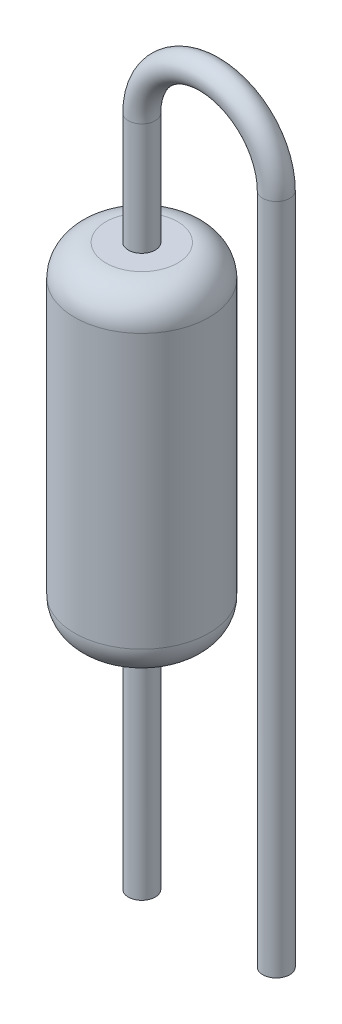
ISO-10303-21;
HEADER;
FILE_DESCRIPTION(('STEP AP214'),'2;1');
FILE_NAME('part.step','',(''),(''),'','','');
FILE_SCHEMA(('AUTOMOTIVE_DESIGN { 1 0 10303 214 1 1 1 1 }'));
ENDSEC;
DATA;
#1=APPLICATION_CONTEXT('core data for automotive mechanical design processes');
#2=APPLICATION_PROTOCOL_DEFINITION('international standard','automotive_design',2000,#1);
#3=PRODUCT_CONTEXT('',#1,'mechanical');
#4=PRODUCT('Part','Part','',(#3));
#5=PRODUCT_RELATED_PRODUCT_CATEGORY('part','',(#4));
#6=PRODUCT_DEFINITION_FORMATION('','',#4);
#7=PRODUCT_DEFINITION_CONTEXT('part definition',#1,'design');
#8=PRODUCT_DEFINITION('design','',#6,#7);
#9=PRODUCT_DEFINITION_SHAPE('','',#8);
#10=(LENGTH_UNIT() NAMED_UNIT(*) SI_UNIT(.MILLI.,.METRE.));
#11=(NAMED_UNIT(*) PLANE_ANGLE_UNIT() SI_UNIT($,.RADIAN.));
#12=(NAMED_UNIT(*) SI_UNIT($,.STERADIAN.) SOLID_ANGLE_UNIT());
#13=UNCERTAINTY_MEASURE_WITH_UNIT(LENGTH_MEASURE(1.E-05),#10,'distance_accuracy_value','');
#14=(GEOMETRIC_REPRESENTATION_CONTEXT(3) GLOBAL_UNCERTAINTY_ASSIGNED_CONTEXT((#13)) GLOBAL_UNIT_ASSIGNED_CONTEXT((#10,
#11,#12)) REPRESENTATION_CONTEXT('',''));
#15=CARTESIAN_POINT('',(0.,0.,0.));
#16=DIRECTION('',(0.,0.,1.));
#17=DIRECTION('',(1.,0.,0.));
#18=AXIS2_PLACEMENT_3D('',#15,#16,#17);
#19=CARTESIAN_POINT('',(0.,15.,0.));
#20=DIRECTION('',(0.,-1.,0.));
#21=DIRECTION('',(0.,0.,-1.));
#22=AXIS2_PLACEMENT_3D('',#19,#20,#21);
#23=CYLINDRICAL_SURFACE('',#22,0.3);
#24=CARTESIAN_POINT('',(0.,15.,0.));
#25=DIRECTION('',(0.,1.,0.));
#26=DIRECTION('',(0.,0.,1.));
#27=AXIS2_PLACEMENT_3D('',#24,#25,#26);
#28=CIRCLE('',#27,0.3);
#29=CARTESIAN_POINT('',(-0.3,15.,0.));
#30=VERTEX_POINT('',#29);
#31=EDGE_CURVE('E62',#30,#30,#28,.T.);
#32=ORIENTED_EDGE('',*,*,#31,.F.);
#33=EDGE_LOOP('',(#32));
#34=FACE_BOUND('',#33,.T.);
#35=CARTESIAN_POINT('',(0.,12.5,0.));
#36=DIRECTION('',(0.,-1.,0.));
#37=DIRECTION('',(0.,0.,-1.));
#38=AXIS2_PLACEMENT_3D('',#35,#36,#37);
#39=CIRCLE('',#38,0.3);
#40=CARTESIAN_POINT('',(0.,12.5,-0.3));
#41=VERTEX_POINT('',#40);
#42=EDGE_CURVE('E49',#41,#41,#39,.T.);
#43=ORIENTED_EDGE('',*,*,#42,.F.);
#44=EDGE_LOOP('',(#43));
#45=FACE_BOUND('',#44,.T.);
#46=ADVANCED_FACE('F29',(#34,#45),#23,.T.);
#47=CARTESIAN_POINT('',(3.,15.,0.));
#48=DIRECTION('',(0.,-1.,0.));
#49=DIRECTION('',(1.,0.,0.));
#50=AXIS2_PLACEMENT_3D('',#47,#48,#49);
#51=CYLINDRICAL_SURFACE('',#50,0.3);
#52=CARTESIAN_POINT('',(3.,15.,0.));
#53=DIRECTION('',(0.,-1.,0.));
#54=DIRECTION('',(0.,0.,1.));
#55=AXIS2_PLACEMENT_3D('',#52,#53,#54);
#56=CIRCLE('',#55,0.3);
#57=CARTESIAN_POINT('',(3.3,15.,0.));
#58=VERTEX_POINT('',#57);
#59=EDGE_CURVE('E59',#58,#58,#56,.T.);
#60=ORIENTED_EDGE('',*,*,#59,.T.);
#61=EDGE_LOOP('',(#60));
#62=FACE_BOUND('',#61,.T.);
#63=CARTESIAN_POINT('',(3.,0.,0.));
#64=DIRECTION('',(0.,-1.,0.));
#65=DIRECTION('',(0.,0.,1.));
#66=AXIS2_PLACEMENT_3D('',#63,#64,#65);
#67=CIRCLE('',#66,0.3);
#68=CARTESIAN_POINT('',(3.,0.,0.3));
#69=VERTEX_POINT('',#68);
#70=EDGE_CURVE('E52',#69,#69,#67,.T.);
#71=ORIENTED_EDGE('',*,*,#70,.F.);
#72=EDGE_LOOP('',(#71));
#73=FACE_BOUND('',#72,.T.);
#74=ADVANCED_FACE('F73',(#62,#73),#51,.T.);
#75=CARTESIAN_POINT('',(1.5,15.,0.));
#76=DIRECTION('',(0.,0.,-1.));
#77=DIRECTION('',(-1.,0.,0.));
#78=AXIS2_PLACEMENT_3D('',#75,#76,#77);
#79=TOROIDAL_SURFACE('',#78,1.5,0.3);
#80=CARTESIAN_POINT('',(1.5,15.,0.));
#81=DIRECTION('',(0.,0.,-1.));
#82=DIRECTION('',(-1.,0.,0.));
#83=AXIS2_PLACEMENT_3D('',#80,#81,#82);
#84=CIRCLE('',#83,1.8);
#85=EDGE_CURVE('',#30,#58,#84,.T.);
#86=ORIENTED_EDGE('',*,*,#31,.T.);
#87=ORIENTED_EDGE('',*,*,#59,.F.);
#88=ORIENTED_EDGE('',*,*,#85,.T.);
#89=ORIENTED_EDGE('',*,*,#85,.F.);
#90=EDGE_LOOP('',(#86,#88,#87,#89));
#91=FACE_BOUND('',#90,.T.);
#92=ADVANCED_FACE('F68',(#91),#79,.T.);
#93=CARTESIAN_POINT('',(3.,0.,0.));
#94=DIRECTION('',(0.,-1.,0.));
#95=DIRECTION('',(0.,0.,1.));
#96=AXIS2_PLACEMENT_3D('',#93,#94,#95);
#97=PLANE('',#96);
#98=ORIENTED_EDGE('',*,*,#70,.T.);
#99=EDGE_LOOP('',(#98));
#100=FACE_BOUND('',#99,.T.);
#101=ADVANCED_FACE('F81',(#100),#97,.T.);
#102=CARTESIAN_POINT('',(0.,12.5,0.));
#103=DIRECTION('',(0.,-1.,0.));
#104=DIRECTION('',(0.,0.,-1.));
#105=AXIS2_PLACEMENT_3D('',#102,#103,#104);
#106=PLANE('',#105);
#107=CARTESIAN_POINT('',(0.,12.5,0.));
#108=DIRECTION('',(0.,-1.,0.));
#109=DIRECTION('',(0.,0.,-1.));
#110=AXIS2_PLACEMENT_3D('',#107,#108,#109);
#111=CIRCLE('',#110,0.8);
#112=CARTESIAN_POINT('',(0.,12.5,-0.8));
#113=VERTEX_POINT('',#112);
#114=EDGE_CURVE('E36',#113,#113,#111,.F.);
#115=ORIENTED_EDGE('',*,*,#114,.T.);
#116=EDGE_LOOP('',(#115));
#117=FACE_BOUND('',#116,.T.);
#118=ORIENTED_EDGE('',*,*,#42,.T.);
#119=EDGE_LOOP('',(#118));
#120=FACE_BOUND('',#119,.T.);
#121=ADVANCED_FACE('F78',(#117,#120),#106,.F.);
#122=CARTESIAN_POINT('',(0.,5.,0.));
#123=DIRECTION('',(0.,-1.,0.));
#124=DIRECTION('',(0.,0.,-1.));
#125=AXIS2_PLACEMENT_3D('',#122,#123,#124);
#126=PLANE('',#125);
#127=CARTESIAN_POINT('',(0.,5.,0.));
#128=DIRECTION('',(0.,-1.,0.));
#129=DIRECTION('',(0.,0.,-1.));
#130=AXIS2_PLACEMENT_3D('',#127,#128,#129);
#131=CIRCLE('',#130,0.8);
#132=CARTESIAN_POINT('',(0.,5.,-0.8));
#133=VERTEX_POINT('',#132);
#134=EDGE_CURVE('E10',#133,#133,#131,.T.);
#135=ORIENTED_EDGE('',*,*,#134,.T.);
#136=EDGE_LOOP('',(#135));
#137=FACE_BOUND('',#136,.T.);
#138=CARTESIAN_POINT('',(0.,5.,0.));
#139=DIRECTION('',(0.,-1.,0.));
#140=DIRECTION('',(0.,0.,-1.));
#141=AXIS2_PLACEMENT_3D('',#138,#139,#140);
#142=CIRCLE('',#141,0.3);
#143=CARTESIAN_POINT('',(0.,5.,-0.3));
#144=VERTEX_POINT('',#143);
#145=EDGE_CURVE('E53',#144,#144,#142,.T.);
#146=ORIENTED_EDGE('',*,*,#145,.F.);
#147=EDGE_LOOP('',(#146));
#148=FACE_BOUND('',#147,.T.);
#149=ADVANCED_FACE('F80',(#137,#148),#126,.T.);
#150=CARTESIAN_POINT('',(0.,12.5,0.));
#151=DIRECTION('',(0.,-1.,0.));
#152=DIRECTION('',(0.,0.,-1.));
#153=AXIS2_PLACEMENT_3D('',#150,#151,#152);
#154=CYLINDRICAL_SURFACE('',#153,1.5);
#155=CARTESIAN_POINT('',(0.,11.8,0.));
#156=DIRECTION('',(0.,-1.,0.));
#157=DIRECTION('',(0.,0.,-1.));
#158=AXIS2_PLACEMENT_3D('',#155,#156,#157);
#159=CIRCLE('',#158,1.5);
#160=CARTESIAN_POINT('',(0.,11.8,-1.5));
#161=VERTEX_POINT('',#160);
#162=EDGE_CURVE('E40',#161,#161,#159,.T.);
#163=ORIENTED_EDGE('',*,*,#162,.T.);
#164=EDGE_LOOP('',(#163));
#165=FACE_BOUND('',#164,.T.);
#166=CARTESIAN_POINT('',(0.,5.7,0.));
#167=DIRECTION('',(0.,-1.,0.));
#168=DIRECTION('',(0.,0.,-1.));
#169=AXIS2_PLACEMENT_3D('',#166,#167,#168);
#170=CIRCLE('',#169,1.5);
#171=CARTESIAN_POINT('',(0.,5.7,-1.5));
#172=VERTEX_POINT('',#171);
#173=EDGE_CURVE('E44',#172,#172,#170,.F.);
#174=ORIENTED_EDGE('',*,*,#173,.T.);
#175=EDGE_LOOP('',(#174));
#176=FACE_BOUND('',#175,.T.);
#177=ADVANCED_FACE('F87',(#165,#176),#154,.T.);
#178=CARTESIAN_POINT('',(0.,0.,0.));
#179=DIRECTION('',(0.,1.,0.));
#180=DIRECTION('',(0.,0.,1.));
#181=AXIS2_PLACEMENT_3D('',#178,#179,#180);
#182=PLANE('',#181);
#183=CARTESIAN_POINT('',(0.,0.,0.));
#184=DIRECTION('',(0.,1.,0.));
#185=DIRECTION('',(0.,0.,1.));
#186=AXIS2_PLACEMENT_3D('',#183,#184,#185);
#187=CIRCLE('',#186,0.3);
#188=CARTESIAN_POINT('',(0.,0.,0.3));
#189=VERTEX_POINT('',#188);
#190=EDGE_CURVE('E56',#189,#189,#187,.T.);
#191=ORIENTED_EDGE('',*,*,#190,.F.);
#192=EDGE_LOOP('',(#191));
#193=FACE_BOUND('',#192,.T.);
#194=ADVANCED_FACE('F93',(#193),#182,.F.);
#195=ORIENTED_EDGE('',*,*,#145,.T.);
#196=EDGE_LOOP('',(#195));
#197=FACE_BOUND('',#196,.T.);
#198=ORIENTED_EDGE('',*,*,#190,.T.);
#199=EDGE_LOOP('',(#198));
#200=FACE_BOUND('',#199,.T.);
#201=ADVANCED_FACE('F75',(#197,#200),#23,.T.);
#202=CARTESIAN_POINT('',(0.,11.8,0.));
#203=DIRECTION('',(0.,-1.,0.));
#204=DIRECTION('',(0.,0.,-1.));
#205=AXIS2_PLACEMENT_3D('',#202,#203,#204);
#206=TOROIDAL_SURFACE('',#205,0.8,0.7);
#207=ORIENTED_EDGE('',*,*,#114,.F.);
#208=EDGE_LOOP('',(#207));
#209=FACE_BOUND('',#208,.T.);
#210=ORIENTED_EDGE('',*,*,#162,.F.);
#211=EDGE_LOOP('',(#210));
#212=FACE_BOUND('',#211,.T.);
#213=ADVANCED_FACE('F100',(#209,#212),#206,.T.);
#214=CARTESIAN_POINT('',(0.,5.7,0.));
#215=DIRECTION('',(0.,-1.,0.));
#216=DIRECTION('',(0.,0.,-1.));
#217=AXIS2_PLACEMENT_3D('',#214,#215,#216);
#218=TOROIDAL_SURFACE('',#217,0.8,0.7);
#219=ORIENTED_EDGE('',*,*,#173,.F.);
#220=EDGE_LOOP('',(#219));
#221=FACE_BOUND('',#220,.T.);
#222=ORIENTED_EDGE('',*,*,#134,.F.);
#223=EDGE_LOOP('',(#222));
#224=FACE_BOUND('',#223,.T.);
#225=ADVANCED_FACE('F31',(#221,#224),#218,.T.);
#226=CLOSED_SHELL('',(#46,#74,#92,#101,#121,#149,#177,#194,#201,#213,#225));
#227=MANIFOLD_SOLID_BREP('B2',#226);
#228=ADVANCED_BREP_SHAPE_REPRESENTATION('',(#18,#227),#14);
#229=SHAPE_DEFINITION_REPRESENTATION(#9,#228);
ENDSEC;
END-ISO-10303-21;
